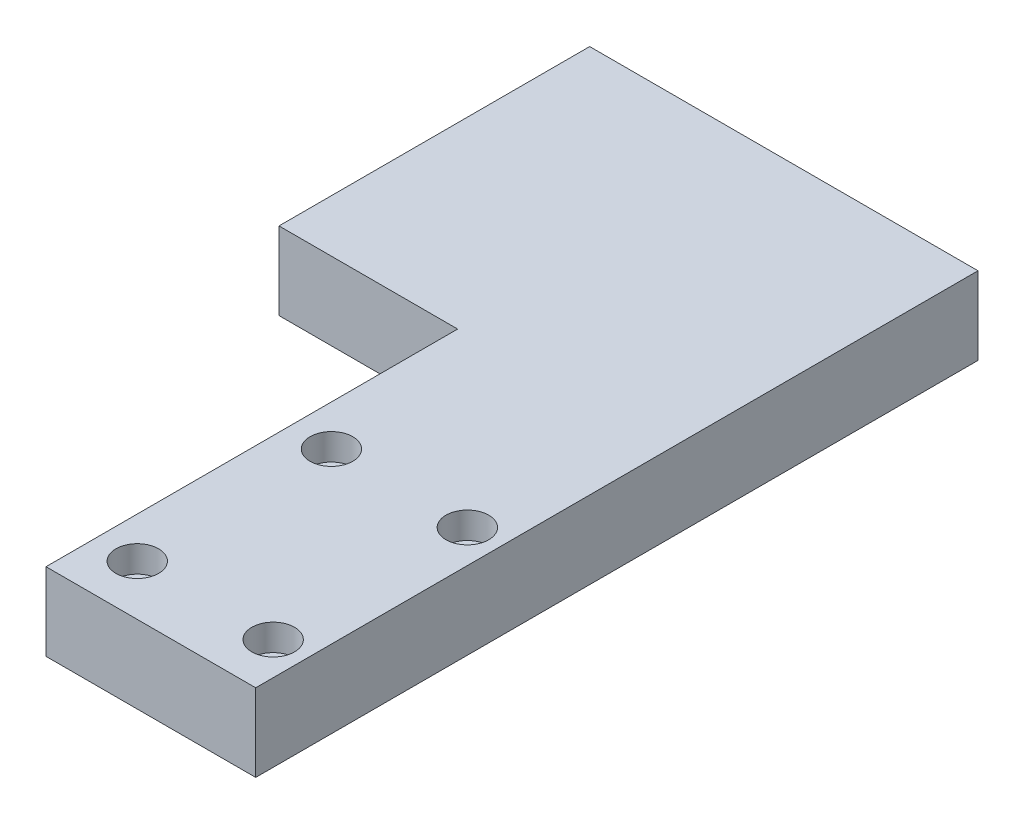
ISO-10303-21;
HEADER;
FILE_DESCRIPTION(('STEP AP214'),'2;1');
FILE_NAME('part.step','',(''),(''),'','','');
FILE_SCHEMA(('AUTOMOTIVE_DESIGN { 1 0 10303 214 1 1 1 1 }'));
ENDSEC;
DATA;
#1=APPLICATION_CONTEXT('core data for automotive mechanical design processes');
#2=APPLICATION_PROTOCOL_DEFINITION('international standard','automotive_design',2000,#1);
#3=PRODUCT_CONTEXT('',#1,'mechanical');
#4=PRODUCT('Part','Part','',(#3));
#5=PRODUCT_RELATED_PRODUCT_CATEGORY('part','',(#4));
#6=PRODUCT_DEFINITION_FORMATION('','',#4);
#7=PRODUCT_DEFINITION_CONTEXT('part definition',#1,'design');
#8=PRODUCT_DEFINITION('design','',#6,#7);
#9=PRODUCT_DEFINITION_SHAPE('','',#8);
#10=(LENGTH_UNIT() NAMED_UNIT(*) SI_UNIT(.MILLI.,.METRE.));
#11=(NAMED_UNIT(*) PLANE_ANGLE_UNIT() SI_UNIT($,.RADIAN.));
#12=(NAMED_UNIT(*) SI_UNIT($,.STERADIAN.) SOLID_ANGLE_UNIT());
#13=UNCERTAINTY_MEASURE_WITH_UNIT(LENGTH_MEASURE(1.E-05),#10,'distance_accuracy_value','');
#14=(GEOMETRIC_REPRESENTATION_CONTEXT(3) GLOBAL_UNCERTAINTY_ASSIGNED_CONTEXT((#13)) GLOBAL_UNIT_ASSIGNED_CONTEXT((#10,
#11,#12)) REPRESENTATION_CONTEXT('',''));
#15=CARTESIAN_POINT('',(0.,0.,0.));
#16=DIRECTION('',(0.,0.,1.));
#17=DIRECTION('',(1.,0.,0.));
#18=AXIS2_PLACEMENT_3D('',#15,#16,#17);
#19=CARTESIAN_POINT('',(0.,10.,0.));
#20=DIRECTION('',(0.,-1.,0.));
#21=DIRECTION('',(0.,0.,-1.));
#22=AXIS2_PLACEMENT_3D('',#19,#20,#21);
#23=PLANE('',#22);
#24=DIRECTION('',(1.,0.,0.));
#25=VECTOR('',#24,1.);
#26=CARTESIAN_POINT('',(-96.,10.,-13.));
#27=LINE('',#26,#25);
#28=CARTESIAN_POINT('',(-50.,10.,-13.));
#29=VERTEX_POINT('',#28);
#30=CARTESIAN_POINT('',(-4.,10.,-13.));
#31=VERTEX_POINT('',#30);
#32=EDGE_CURVE('E133',#29,#31,#27,.T.);
#33=ORIENTED_EDGE('',*,*,#32,.T.);
#34=DIRECTION('',(0.,0.,1.));
#35=VECTOR('',#34,1.);
#36=CARTESIAN_POINT('',(-4.,10.,199.));
#37=LINE('',#36,#35);
#38=CARTESIAN_POINT('',(-4.,10.,93.));
#39=VERTEX_POINT('',#38);
#40=EDGE_CURVE('E131',#31,#39,#37,.T.);
#41=ORIENTED_EDGE('',*,*,#40,.T.);
#42=DIRECTION('',(1.,0.,0.));
#43=VECTOR('',#42,1.);
#44=CARTESIAN_POINT('',(-50.,10.,93.));
#45=LINE('',#44,#43);
#46=CARTESIAN_POINT('',(50.,10.,93.));
#47=VERTEX_POINT('',#46);
#48=EDGE_CURVE('E42',#39,#47,#45,.T.);
#49=ORIENTED_EDGE('',*,*,#48,.T.);
#50=DIRECTION('',(0.,0.,-1.));
#51=VECTOR('',#50,1.);
#52=CARTESIAN_POINT('',(50.,10.,93.));
#53=LINE('',#52,#51);
#54=CARTESIAN_POINT('',(50.,10.,-93.));
#55=VERTEX_POINT('',#54);
#56=EDGE_CURVE('E144',#47,#55,#53,.T.);
#57=ORIENTED_EDGE('',*,*,#56,.T.);
#58=DIRECTION('',(-1.,0.,0.));
#59=VECTOR('',#58,1.);
#60=CARTESIAN_POINT('',(-50.,10.,-93.));
#61=LINE('',#60,#59);
#62=CARTESIAN_POINT('',(-50.,10.,-93.));
#63=VERTEX_POINT('',#62);
#64=EDGE_CURVE('E66',#55,#63,#61,.T.);
#65=ORIENTED_EDGE('',*,*,#64,.T.);
#66=DIRECTION('',(0.,0.,1.));
#67=VECTOR('',#66,1.);
#68=CARTESIAN_POINT('',(-50.,10.,93.));
#69=LINE('',#68,#67);
#70=EDGE_CURVE('E147',#63,#29,#69,.T.);
#71=ORIENTED_EDGE('',*,*,#70,.T.);
#72=EDGE_LOOP('',(#33,#41,#49,#57,#65,#71));
#73=FACE_BOUND('',#72,.T.);
#74=CARTESIAN_POINT('',(41.5,10.,80.));
#75=DIRECTION('',(0.,1.,0.));
#76=DIRECTION('',(0.,0.,1.));
#77=AXIS2_PLACEMENT_3D('',#74,#75,#76);
#78=CIRCLE('',#77,5.5);
#79=CARTESIAN_POINT('',(41.5,10.,85.5));
#80=VERTEX_POINT('',#79);
#81=EDGE_CURVE('E172',#80,#80,#78,.T.);
#82=ORIENTED_EDGE('',*,*,#81,.F.);
#83=EDGE_LOOP('',(#82));
#84=FACE_BOUND('',#83,.T.);
#85=CARTESIAN_POINT('',(41.5,10.,30.));
#86=DIRECTION('',(0.,1.,0.));
#87=DIRECTION('',(0.,0.,1.));
#88=AXIS2_PLACEMENT_3D('',#85,#86,#87);
#89=CIRCLE('',#88,5.5);
#90=CARTESIAN_POINT('',(41.5,10.,35.5));
#91=VERTEX_POINT('',#90);
#92=EDGE_CURVE('E176',#91,#91,#89,.T.);
#93=ORIENTED_EDGE('',*,*,#92,.F.);
#94=EDGE_LOOP('',(#93));
#95=FACE_BOUND('',#94,.T.);
#96=CARTESIAN_POINT('',(6.5,10.,80.));
#97=DIRECTION('',(0.,1.,0.));
#98=DIRECTION('',(0.,0.,1.));
#99=AXIS2_PLACEMENT_3D('',#96,#97,#98);
#100=CIRCLE('',#99,5.5);
#101=CARTESIAN_POINT('',(6.5,10.,85.5));
#102=VERTEX_POINT('',#101);
#103=EDGE_CURVE('E384',#102,#102,#100,.T.);
#104=ORIENTED_EDGE('',*,*,#103,.F.);
#105=EDGE_LOOP('',(#104));
#106=FACE_BOUND('',#105,.T.);
#107=CARTESIAN_POINT('',(6.5,10.,30.));
#108=DIRECTION('',(0.,1.,0.));
#109=DIRECTION('',(0.,0.,1.));
#110=AXIS2_PLACEMENT_3D('',#107,#108,#109);
#111=CIRCLE('',#110,5.5);
#112=CARTESIAN_POINT('',(6.5,10.,35.5));
#113=VERTEX_POINT('',#112);
#114=EDGE_CURVE('E373',#113,#113,#111,.T.);
#115=ORIENTED_EDGE('',*,*,#114,.F.);
#116=EDGE_LOOP('',(#115));
#117=FACE_BOUND('',#116,.T.);
#118=ADVANCED_FACE('F17',(#73,#84,#95,#106,#117),#23,.F.);
#119=CARTESIAN_POINT('',(50.,10.,93.));
#120=DIRECTION('',(-1.,0.,0.));
#121=DIRECTION('',(0.,0.,1.));
#122=AXIS2_PLACEMENT_3D('',#119,#120,#121);
#123=PLANE('',#122);
#124=DIRECTION('',(0.,0.,-1.));
#125=VECTOR('',#124,1.);
#126=CARTESIAN_POINT('',(50.,-10.,93.));
#127=LINE('',#126,#125);
#128=CARTESIAN_POINT('',(50.,-10.,93.));
#129=VERTEX_POINT('',#128);
#130=CARTESIAN_POINT('',(50.,-10.,-93.));
#131=VERTEX_POINT('',#130);
#132=EDGE_CURVE('E143',#129,#131,#127,.T.);
#133=ORIENTED_EDGE('',*,*,#132,.T.);
#134=DIRECTION('',(0.,-1.,0.));
#135=VECTOR('',#134,1.);
#136=CARTESIAN_POINT('',(50.,10.,-93.));
#137=LINE('',#136,#135);
#138=EDGE_CURVE('E26',#55,#131,#137,.T.);
#139=ORIENTED_EDGE('',*,*,#138,.F.);
#140=ORIENTED_EDGE('',*,*,#56,.F.);
#141=DIRECTION('',(0.,-1.,0.));
#142=VECTOR('',#141,1.);
#143=CARTESIAN_POINT('',(50.,10.,93.));
#144=LINE('',#143,#142);
#145=EDGE_CURVE('E151',#47,#129,#144,.T.);
#146=ORIENTED_EDGE('',*,*,#145,.T.);
#147=EDGE_LOOP('',(#133,#139,#140,#146));
#148=FACE_BOUND('',#147,.T.);
#149=ADVANCED_FACE('F19',(#148),#123,.F.);
#150=CARTESIAN_POINT('',(-50.,10.,-93.));
#151=DIRECTION('',(0.,0.,1.));
#152=DIRECTION('',(1.,0.,0.));
#153=AXIS2_PLACEMENT_3D('',#150,#151,#152);
#154=PLANE('',#153);
#155=DIRECTION('',(-1.,0.,0.));
#156=VECTOR('',#155,1.);
#157=CARTESIAN_POINT('',(-50.,-10.,-93.));
#158=LINE('',#157,#156);
#159=CARTESIAN_POINT('',(-50.,-10.,-93.));
#160=VERTEX_POINT('',#159);
#161=EDGE_CURVE('E154',#131,#160,#158,.T.);
#162=ORIENTED_EDGE('',*,*,#161,.T.);
#163=DIRECTION('',(0.,-1.,0.));
#164=VECTOR('',#163,1.);
#165=CARTESIAN_POINT('',(-50.,10.,-93.));
#166=LINE('',#165,#164);
#167=EDGE_CURVE('E161',#63,#160,#166,.T.);
#168=ORIENTED_EDGE('',*,*,#167,.F.);
#169=ORIENTED_EDGE('',*,*,#64,.F.);
#170=ORIENTED_EDGE('',*,*,#138,.T.);
#171=EDGE_LOOP('',(#162,#168,#169,#170));
#172=FACE_BOUND('',#171,.T.);
#173=ADVANCED_FACE('F227',(#172),#154,.F.);
#174=CARTESIAN_POINT('',(-50.,10.,93.));
#175=DIRECTION('',(1.,0.,0.));
#176=DIRECTION('',(0.,0.,-1.));
#177=AXIS2_PLACEMENT_3D('',#174,#175,#176);
#178=PLANE('',#177);
#179=CARTESIAN_POINT('',(-50.,0.,-83.));
#180=DIRECTION('',(-1.,0.,0.));
#181=DIRECTION('',(0.,0.,1.));
#182=AXIS2_PLACEMENT_3D('',#179,#180,#181);
#183=CIRCLE('',#182,4.);
#184=CARTESIAN_POINT('',(-50.,0.,-79.));
#185=VERTEX_POINT('',#184);
#186=EDGE_CURVE('E168',#185,#185,#183,.T.);
#187=ORIENTED_EDGE('',*,*,#186,.F.);
#188=EDGE_LOOP('',(#187));
#189=FACE_BOUND('',#188,.T.);
#190=CARTESIAN_POINT('',(-50.,0.,-53.));
#191=DIRECTION('',(-1.,0.,0.));
#192=DIRECTION('',(0.,0.,1.));
#193=AXIS2_PLACEMENT_3D('',#190,#191,#192);
#194=CIRCLE('',#193,4.);
#195=CARTESIAN_POINT('',(-50.,0.,-49.));
#196=VERTEX_POINT('',#195);
#197=EDGE_CURVE('E99',#196,#196,#194,.T.);
#198=ORIENTED_EDGE('',*,*,#197,.F.);
#199=EDGE_LOOP('',(#198));
#200=FACE_BOUND('',#199,.T.);
#201=CARTESIAN_POINT('',(-50.,0.,-23.));
#202=DIRECTION('',(-1.,0.,0.));
#203=DIRECTION('',(0.,0.,1.));
#204=AXIS2_PLACEMENT_3D('',#201,#202,#203);
#205=CIRCLE('',#204,4.);
#206=CARTESIAN_POINT('',(-50.,0.,-19.));
#207=VERTEX_POINT('',#206);
#208=EDGE_CURVE('E118',#207,#207,#205,.T.);
#209=ORIENTED_EDGE('',*,*,#208,.F.);
#210=EDGE_LOOP('',(#209));
#211=FACE_BOUND('',#210,.T.);
#212=DIRECTION('',(0.,0.,1.));
#213=VECTOR('',#212,1.);
#214=CARTESIAN_POINT('',(-50.,-10.,93.));
#215=LINE('',#214,#213);
#216=CARTESIAN_POINT('',(-50.,-10.,-13.));
#217=VERTEX_POINT('',#216);
#218=EDGE_CURVE('E156',#160,#217,#215,.T.);
#219=ORIENTED_EDGE('',*,*,#218,.T.);
#220=DIRECTION('',(0.,1.,0.));
#221=VECTOR('',#220,1.);
#222=CARTESIAN_POINT('',(-50.,10.,-13.));
#223=LINE('',#222,#221);
#224=EDGE_CURVE('E33',#217,#29,#223,.T.);
#225=ORIENTED_EDGE('',*,*,#224,.T.);
#226=ORIENTED_EDGE('',*,*,#70,.F.);
#227=ORIENTED_EDGE('',*,*,#167,.T.);
#228=EDGE_LOOP('',(#219,#225,#226,#227));
#229=FACE_BOUND('',#228,.T.);
#230=ADVANCED_FACE('F223',(#189,#200,#211,#229),#178,.F.);
#231=CARTESIAN_POINT('',(-50.,10.,93.));
#232=DIRECTION('',(0.,0.,-1.));
#233=DIRECTION('',(-1.,0.,0.));
#234=AXIS2_PLACEMENT_3D('',#231,#232,#233);
#235=PLANE('',#234);
#236=ORIENTED_EDGE('',*,*,#48,.F.);
#237=DIRECTION('',(0.,-1.,0.));
#238=VECTOR('',#237,1.);
#239=CARTESIAN_POINT('',(-4.,10.,93.));
#240=LINE('',#239,#238);
#241=CARTESIAN_POINT('',(-4.,-10.,93.));
#242=VERTEX_POINT('',#241);
#243=EDGE_CURVE('E141',#39,#242,#240,.T.);
#244=ORIENTED_EDGE('',*,*,#243,.T.);
#245=DIRECTION('',(1.,0.,0.));
#246=VECTOR('',#245,1.);
#247=CARTESIAN_POINT('',(-50.,-10.,93.));
#248=LINE('',#247,#246);
#249=EDGE_CURVE('E60',#242,#129,#248,.T.);
#250=ORIENTED_EDGE('',*,*,#249,.T.);
#251=ORIENTED_EDGE('',*,*,#145,.F.);
#252=EDGE_LOOP('',(#236,#244,#250,#251));
#253=FACE_BOUND('',#252,.T.);
#254=ADVANCED_FACE('F226',(#253),#235,.F.);
#255=CARTESIAN_POINT('',(0.,-10.,0.));
#256=DIRECTION('',(0.,-1.,0.));
#257=DIRECTION('',(0.,0.,-1.));
#258=AXIS2_PLACEMENT_3D('',#255,#256,#257);
#259=PLANE('',#258);
#260=CARTESIAN_POINT('',(6.5,-10.,30.));
#261=DIRECTION('',(0.,-1.,0.));
#262=DIRECTION('',(0.,0.,-1.));
#263=AXIS2_PLACEMENT_3D('',#260,#261,#262);
#264=CIRCLE('',#263,2.88393012941235);
#265=CARTESIAN_POINT('',(6.5,-10.,27.1160698705877));
#266=VERTEX_POINT('',#265);
#267=EDGE_CURVE('E21',#266,#266,#264,.T.);
#268=ORIENTED_EDGE('',*,*,#267,.F.);
#269=EDGE_LOOP('',(#268));
#270=FACE_BOUND('',#269,.T.);
#271=CARTESIAN_POINT('',(6.5,-10.,80.));
#272=DIRECTION('',(0.,-1.,0.));
#273=DIRECTION('',(0.,0.,-1.));
#274=AXIS2_PLACEMENT_3D('',#271,#272,#273);
#275=CIRCLE('',#274,2.88393012941235);
#276=CARTESIAN_POINT('',(6.5,-10.,77.1160698705877));
#277=VERTEX_POINT('',#276);
#278=EDGE_CURVE('E174',#277,#277,#275,.T.);
#279=ORIENTED_EDGE('',*,*,#278,.F.);
#280=EDGE_LOOP('',(#279));
#281=FACE_BOUND('',#280,.T.);
#282=CARTESIAN_POINT('',(41.5,-10.,30.));
#283=DIRECTION('',(0.,-1.,0.));
#284=DIRECTION('',(0.,0.,-1.));
#285=AXIS2_PLACEMENT_3D('',#282,#283,#284);
#286=CIRCLE('',#285,2.88393012941235);
#287=CARTESIAN_POINT('',(41.5,-10.,27.1160698705877));
#288=VERTEX_POINT('',#287);
#289=EDGE_CURVE('E170',#288,#288,#286,.T.);
#290=ORIENTED_EDGE('',*,*,#289,.F.);
#291=EDGE_LOOP('',(#290));
#292=FACE_BOUND('',#291,.T.);
#293=CARTESIAN_POINT('',(41.5,-10.,80.));
#294=DIRECTION('',(0.,-1.,0.));
#295=DIRECTION('',(0.,0.,-1.));
#296=AXIS2_PLACEMENT_3D('',#293,#294,#295);
#297=CIRCLE('',#296,2.88393012941235);
#298=CARTESIAN_POINT('',(41.5,-10.,77.1160698705877));
#299=VERTEX_POINT('',#298);
#300=EDGE_CURVE('E165',#299,#299,#297,.T.);
#301=ORIENTED_EDGE('',*,*,#300,.F.);
#302=EDGE_LOOP('',(#301));
#303=FACE_BOUND('',#302,.T.);
#304=DIRECTION('',(0.,0.,1.));
#305=VECTOR('',#304,1.);
#306=CARTESIAN_POINT('',(-4.,-10.,199.));
#307=LINE('',#306,#305);
#308=CARTESIAN_POINT('',(-4.,-10.,-13.));
#309=VERTEX_POINT('',#308);
#310=EDGE_CURVE('E130',#309,#242,#307,.T.);
#311=ORIENTED_EDGE('',*,*,#310,.F.);
#312=DIRECTION('',(1.,0.,0.));
#313=VECTOR('',#312,1.);
#314=CARTESIAN_POINT('',(0.,-10.,-13.));
#315=LINE('',#314,#313);
#316=EDGE_CURVE('E11',#217,#309,#315,.T.);
#317=ORIENTED_EDGE('',*,*,#316,.F.);
#318=ORIENTED_EDGE('',*,*,#218,.F.);
#319=ORIENTED_EDGE('',*,*,#161,.F.);
#320=ORIENTED_EDGE('',*,*,#132,.F.);
#321=ORIENTED_EDGE('',*,*,#249,.F.);
#322=EDGE_LOOP('',(#311,#317,#318,#319,#320,#321));
#323=FACE_BOUND('',#322,.T.);
#324=ADVANCED_FACE('F237',(#270,#281,#292,#303,#323),#259,.T.);
#325=CARTESIAN_POINT('',(-4.,10.,199.));
#326=DIRECTION('',(1.,0.,0.));
#327=DIRECTION('',(0.,0.,-1.));
#328=AXIS2_PLACEMENT_3D('',#325,#326,#327);
#329=PLANE('',#328);
#330=ORIENTED_EDGE('',*,*,#40,.F.);
#331=DIRECTION('',(0.,-1.,0.));
#332=VECTOR('',#331,1.);
#333=CARTESIAN_POINT('',(-4.,10.,-13.));
#334=LINE('',#333,#332);
#335=EDGE_CURVE('E136',#31,#309,#334,.T.);
#336=ORIENTED_EDGE('',*,*,#335,.T.);
#337=ORIENTED_EDGE('',*,*,#310,.T.);
#338=ORIENTED_EDGE('',*,*,#243,.F.);
#339=EDGE_LOOP('',(#330,#336,#337,#338));
#340=FACE_BOUND('',#339,.T.);
#341=ADVANCED_FACE('F242',(#340),#329,.F.);
#342=CARTESIAN_POINT('',(-96.,10.,-13.));
#343=DIRECTION('',(0.,0.,-1.));
#344=DIRECTION('',(-1.,0.,0.));
#345=AXIS2_PLACEMENT_3D('',#342,#343,#344);
#346=PLANE('',#345);
#347=ORIENTED_EDGE('',*,*,#316,.T.);
#348=ORIENTED_EDGE('',*,*,#335,.F.);
#349=ORIENTED_EDGE('',*,*,#32,.F.);
#350=ORIENTED_EDGE('',*,*,#224,.F.);
#351=EDGE_LOOP('',(#347,#348,#349,#350));
#352=FACE_BOUND('',#351,.T.);
#353=ADVANCED_FACE('F239',(#352),#346,.F.);
#354=CARTESIAN_POINT('',(-30.25,0.,-23.));
#355=DIRECTION('',(-1.,0.,0.));
#356=DIRECTION('',(0.,0.,1.));
#357=AXIS2_PLACEMENT_3D('',#354,#355,#356);
#358=CONICAL_SURFACE('',#357,3.4,1.02974425867665);
#359=CARTESIAN_POINT('',(-28.2070738953063,0.,-23.));
#360=VERTEX_POINT('',#359);
#361=VERTEX_LOOP('',#360);
#362=FACE_BOUND('',#361,.T.);
#363=CARTESIAN_POINT('',(-30.25,0.,-23.));
#364=DIRECTION('',(-1.,0.,0.));
#365=DIRECTION('',(0.,0.,1.));
#366=AXIS2_PLACEMENT_3D('',#363,#364,#365);
#367=CIRCLE('',#366,3.4);
#368=CARTESIAN_POINT('',(-30.25,0.,-19.6));
#369=VERTEX_POINT('',#368);
#370=EDGE_CURVE('E127',#369,#369,#367,.T.);
#371=ORIENTED_EDGE('',*,*,#370,.T.);
#372=EDGE_LOOP('',(#371));
#373=FACE_BOUND('',#372,.T.);
#374=ADVANCED_FACE('F267',(#362,#373),#358,.F.);
#375=CARTESIAN_POINT('',(-50.,0.,-23.));
#376=DIRECTION('',(-1.,0.,0.));
#377=DIRECTION('',(0.,0.,1.));
#378=AXIS2_PLACEMENT_3D('',#375,#376,#377);
#379=CYLINDRICAL_SURFACE('',#378,3.4);
#380=ORIENTED_EDGE('',*,*,#370,.F.);
#381=EDGE_LOOP('',(#380));
#382=FACE_BOUND('',#381,.T.);
#383=CARTESIAN_POINT('',(-34.,0.,-23.));
#384=DIRECTION('',(-1.,0.,0.));
#385=DIRECTION('',(0.,0.,1.));
#386=AXIS2_PLACEMENT_3D('',#383,#384,#385);
#387=CIRCLE('',#386,3.4);
#388=CARTESIAN_POINT('',(-34.,0.,-19.6));
#389=VERTEX_POINT('',#388);
#390=EDGE_CURVE('E124',#389,#389,#387,.T.);
#391=ORIENTED_EDGE('',*,*,#390,.T.);
#392=EDGE_LOOP('',(#391));
#393=FACE_BOUND('',#392,.T.);
#394=ADVANCED_FACE('F270',(#382,#393),#379,.F.);
#395=CARTESIAN_POINT('',(-34.,3.4,-23.));
#396=DIRECTION('',(1.,0.,0.));
#397=DIRECTION('',(0.,0.,-1.));
#398=AXIS2_PLACEMENT_3D('',#395,#396,#397);
#399=PLANE('',#398);
#400=ORIENTED_EDGE('',*,*,#390,.F.);
#401=EDGE_LOOP('',(#400));
#402=FACE_BOUND('',#401,.T.);
#403=CARTESIAN_POINT('',(-34.,0.,-23.));
#404=DIRECTION('',(-1.,0.,0.));
#405=DIRECTION('',(0.,0.,1.));
#406=AXIS2_PLACEMENT_3D('',#403,#404,#405);
#407=CIRCLE('',#406,4.);
#408=CARTESIAN_POINT('',(-34.,0.,-19.));
#409=VERTEX_POINT('',#408);
#410=EDGE_CURVE('E121',#409,#409,#407,.T.);
#411=ORIENTED_EDGE('',*,*,#410,.T.);
#412=EDGE_LOOP('',(#411));
#413=FACE_BOUND('',#412,.T.);
#414=ADVANCED_FACE('F274',(#402,#413),#399,.F.);
#415=CARTESIAN_POINT('',(-50.,0.,-23.));
#416=DIRECTION('',(-1.,0.,0.));
#417=DIRECTION('',(0.,0.,1.));
#418=AXIS2_PLACEMENT_3D('',#415,#416,#417);
#419=CYLINDRICAL_SURFACE('',#418,4.);
#420=ORIENTED_EDGE('',*,*,#410,.F.);
#421=EDGE_LOOP('',(#420));
#422=FACE_BOUND('',#421,.T.);
#423=ORIENTED_EDGE('',*,*,#208,.T.);
#424=EDGE_LOOP('',(#423));
#425=FACE_BOUND('',#424,.T.);
#426=ADVANCED_FACE('F278',(#422,#425),#419,.F.);
#427=CARTESIAN_POINT('',(-30.25,0.,-53.));
#428=DIRECTION('',(-1.,0.,0.));
#429=DIRECTION('',(0.,0.,1.));
#430=AXIS2_PLACEMENT_3D('',#427,#428,#429);
#431=CONICAL_SURFACE('',#430,3.4,1.02974425867665);
#432=CARTESIAN_POINT('',(-28.2070738953063,0.,-53.));
#433=VERTEX_POINT('',#432);
#434=VERTEX_LOOP('',#433);
#435=FACE_BOUND('',#434,.T.);
#436=CARTESIAN_POINT('',(-30.25,0.,-53.));
#437=DIRECTION('',(-1.,0.,0.));
#438=DIRECTION('',(0.,0.,1.));
#439=AXIS2_PLACEMENT_3D('',#436,#437,#438);
#440=CIRCLE('',#439,3.4);
#441=CARTESIAN_POINT('',(-30.25,0.,-49.6));
#442=VERTEX_POINT('',#441);
#443=EDGE_CURVE('E115',#442,#442,#440,.T.);
#444=ORIENTED_EDGE('',*,*,#443,.T.);
#445=EDGE_LOOP('',(#444));
#446=FACE_BOUND('',#445,.T.);
#447=ADVANCED_FACE('F282',(#435,#446),#431,.F.);
#448=CARTESIAN_POINT('',(-50.,0.,-53.));
#449=DIRECTION('',(-1.,0.,0.));
#450=DIRECTION('',(0.,0.,1.));
#451=AXIS2_PLACEMENT_3D('',#448,#449,#450);
#452=CYLINDRICAL_SURFACE('',#451,3.4);
#453=ORIENTED_EDGE('',*,*,#443,.F.);
#454=EDGE_LOOP('',(#453));
#455=FACE_BOUND('',#454,.T.);
#456=CARTESIAN_POINT('',(-34.,0.,-53.));
#457=DIRECTION('',(-1.,0.,0.));
#458=DIRECTION('',(0.,0.,1.));
#459=AXIS2_PLACEMENT_3D('',#456,#457,#458);
#460=CIRCLE('',#459,3.4);
#461=CARTESIAN_POINT('',(-34.,0.,-49.6));
#462=VERTEX_POINT('',#461);
#463=EDGE_CURVE('E112',#462,#462,#460,.T.);
#464=ORIENTED_EDGE('',*,*,#463,.T.);
#465=EDGE_LOOP('',(#464));
#466=FACE_BOUND('',#465,.T.);
#467=ADVANCED_FACE('F286',(#455,#466),#452,.F.);
#468=CARTESIAN_POINT('',(-34.,3.4,-53.));
#469=DIRECTION('',(1.,0.,0.));
#470=DIRECTION('',(0.,0.,-1.));
#471=AXIS2_PLACEMENT_3D('',#468,#469,#470);
#472=PLANE('',#471);
#473=ORIENTED_EDGE('',*,*,#463,.F.);
#474=EDGE_LOOP('',(#473));
#475=FACE_BOUND('',#474,.T.);
#476=CARTESIAN_POINT('',(-34.,0.,-53.));
#477=DIRECTION('',(-1.,0.,0.));
#478=DIRECTION('',(0.,0.,1.));
#479=AXIS2_PLACEMENT_3D('',#476,#477,#478);
#480=CIRCLE('',#479,4.);
#481=CARTESIAN_POINT('',(-34.,0.,-49.));
#482=VERTEX_POINT('',#481);
#483=EDGE_CURVE('E103',#482,#482,#480,.T.);
#484=ORIENTED_EDGE('',*,*,#483,.T.);
#485=EDGE_LOOP('',(#484));
#486=FACE_BOUND('',#485,.T.);
#487=ADVANCED_FACE('F290',(#475,#486),#472,.F.);
#488=CARTESIAN_POINT('',(-50.,0.,-53.));
#489=DIRECTION('',(-1.,0.,0.));
#490=DIRECTION('',(0.,0.,1.));
#491=AXIS2_PLACEMENT_3D('',#488,#489,#490);
#492=CYLINDRICAL_SURFACE('',#491,4.);
#493=ORIENTED_EDGE('',*,*,#483,.F.);
#494=EDGE_LOOP('',(#493));
#495=FACE_BOUND('',#494,.T.);
#496=ORIENTED_EDGE('',*,*,#197,.T.);
#497=EDGE_LOOP('',(#496));
#498=FACE_BOUND('',#497,.T.);
#499=ADVANCED_FACE('F93',(#495,#498),#492,.F.);
#500=CARTESIAN_POINT('',(-30.25,0.,-83.));
#501=DIRECTION('',(-1.,0.,0.));
#502=DIRECTION('',(0.,0.,1.));
#503=AXIS2_PLACEMENT_3D('',#500,#501,#502);
#504=CONICAL_SURFACE('',#503,3.4,1.02974425867665);
#505=CARTESIAN_POINT('',(-28.2070738953063,0.,-83.));
#506=VERTEX_POINT('',#505);
#507=VERTEX_LOOP('',#506);
#508=FACE_BOUND('',#507,.T.);
#509=CARTESIAN_POINT('',(-30.25,0.,-83.));
#510=DIRECTION('',(-1.,0.,0.));
#511=DIRECTION('',(0.,0.,1.));
#512=AXIS2_PLACEMENT_3D('',#509,#510,#511);
#513=CIRCLE('',#512,3.4);
#514=CARTESIAN_POINT('',(-30.25,0.,-79.6));
#515=VERTEX_POINT('',#514);
#516=EDGE_CURVE('E97',#515,#515,#513,.T.);
#517=ORIENTED_EDGE('',*,*,#516,.T.);
#518=EDGE_LOOP('',(#517));
#519=FACE_BOUND('',#518,.T.);
#520=ADVANCED_FACE('F89',(#508,#519),#504,.F.);
#521=CARTESIAN_POINT('',(-50.,0.,-83.));
#522=DIRECTION('',(-1.,0.,0.));
#523=DIRECTION('',(0.,0.,1.));
#524=AXIS2_PLACEMENT_3D('',#521,#522,#523);
#525=CYLINDRICAL_SURFACE('',#524,3.4);
#526=ORIENTED_EDGE('',*,*,#516,.F.);
#527=EDGE_LOOP('',(#526));
#528=FACE_BOUND('',#527,.T.);
#529=CARTESIAN_POINT('',(-34.,0.,-83.));
#530=DIRECTION('',(-1.,0.,0.));
#531=DIRECTION('',(0.,0.,1.));
#532=AXIS2_PLACEMENT_3D('',#529,#530,#531);
#533=CIRCLE('',#532,3.4);
#534=CARTESIAN_POINT('',(-34.,0.,-79.6));
#535=VERTEX_POINT('',#534);
#536=EDGE_CURVE('E100',#535,#535,#533,.T.);
#537=ORIENTED_EDGE('',*,*,#536,.T.);
#538=EDGE_LOOP('',(#537));
#539=FACE_BOUND('',#538,.T.);
#540=ADVANCED_FACE('F92',(#528,#539),#525,.F.);
#541=CARTESIAN_POINT('',(-34.,3.4,-83.));
#542=DIRECTION('',(1.,0.,0.));
#543=DIRECTION('',(0.,0.,-1.));
#544=AXIS2_PLACEMENT_3D('',#541,#542,#543);
#545=PLANE('',#544);
#546=ORIENTED_EDGE('',*,*,#536,.F.);
#547=EDGE_LOOP('',(#546));
#548=FACE_BOUND('',#547,.T.);
#549=CARTESIAN_POINT('',(-34.,0.,-83.));
#550=DIRECTION('',(-1.,0.,0.));
#551=DIRECTION('',(0.,0.,1.));
#552=AXIS2_PLACEMENT_3D('',#549,#550,#551);
#553=CIRCLE('',#552,4.);
#554=CARTESIAN_POINT('',(-34.,0.,-79.));
#555=VERTEX_POINT('',#554);
#556=EDGE_CURVE('E106',#555,#555,#553,.T.);
#557=ORIENTED_EDGE('',*,*,#556,.T.);
#558=EDGE_LOOP('',(#557));
#559=FACE_BOUND('',#558,.T.);
#560=ADVANCED_FACE('F214',(#548,#559),#545,.F.);
#561=CARTESIAN_POINT('',(-50.,0.,-83.));
#562=DIRECTION('',(-1.,0.,0.));
#563=DIRECTION('',(0.,0.,1.));
#564=AXIS2_PLACEMENT_3D('',#561,#562,#563);
#565=CYLINDRICAL_SURFACE('',#564,4.);
#566=ORIENTED_EDGE('',*,*,#556,.F.);
#567=EDGE_LOOP('',(#566));
#568=FACE_BOUND('',#567,.T.);
#569=ORIENTED_EDGE('',*,*,#186,.T.);
#570=EDGE_LOOP('',(#569));
#571=FACE_BOUND('',#570,.T.);
#572=ADVANCED_FACE('F216',(#568,#571),#565,.F.);
#573=CARTESIAN_POINT('',(41.5,-9.75,80.));
#574=DIRECTION('',(0.,1.,0.));
#575=DIRECTION('',(0.,0.,1.));
#576=AXIS2_PLACEMENT_3D('',#573,#574,#575);
#577=CONICAL_SURFACE('',#576,3.3,1.02974425867665);
#578=ORIENTED_EDGE('',*,*,#300,.T.);
#579=EDGE_LOOP('',(#578));
#580=FACE_BOUND('',#579,.T.);
#581=CARTESIAN_POINT('',(41.5,-9.75,80.));
#582=DIRECTION('',(0.,1.,0.));
#583=DIRECTION('',(0.,0.,1.));
#584=AXIS2_PLACEMENT_3D('',#581,#582,#583);
#585=CIRCLE('',#584,3.3);
#586=CARTESIAN_POINT('',(41.5,-9.75,83.3));
#587=VERTEX_POINT('',#586);
#588=EDGE_CURVE('E169',#587,#587,#585,.T.);
#589=ORIENTED_EDGE('',*,*,#588,.T.);
#590=EDGE_LOOP('',(#589));
#591=FACE_BOUND('',#590,.T.);
#592=ADVANCED_FACE('F219',(#580,#591),#577,.F.);
#593=CARTESIAN_POINT('',(41.5,10.,80.));
#594=DIRECTION('',(0.,1.,0.));
#595=DIRECTION('',(0.,0.,1.));
#596=AXIS2_PLACEMENT_3D('',#593,#594,#595);
#597=CYLINDRICAL_SURFACE('',#596,3.3);
#598=ORIENTED_EDGE('',*,*,#588,.F.);
#599=EDGE_LOOP('',(#598));
#600=FACE_BOUND('',#599,.T.);
#601=CARTESIAN_POINT('',(41.5,3.2,80.));
#602=DIRECTION('',(0.,1.,0.));
#603=DIRECTION('',(0.,0.,1.));
#604=AXIS2_PLACEMENT_3D('',#601,#602,#603);
#605=CIRCLE('',#604,3.3);
#606=CARTESIAN_POINT('',(41.5,3.2,83.3));
#607=VERTEX_POINT('',#606);
#608=EDGE_CURVE('E205',#607,#607,#605,.T.);
#609=ORIENTED_EDGE('',*,*,#608,.T.);
#610=EDGE_LOOP('',(#609));
#611=FACE_BOUND('',#610,.T.);
#612=ADVANCED_FACE('F305',(#600,#611),#597,.F.);
#613=CARTESIAN_POINT('',(44.8,3.2,80.));
#614=DIRECTION('',(0.,-1.,0.));
#615=DIRECTION('',(0.,0.,-1.));
#616=AXIS2_PLACEMENT_3D('',#613,#614,#615);
#617=PLANE('',#616);
#618=ORIENTED_EDGE('',*,*,#608,.F.);
#619=EDGE_LOOP('',(#618));
#620=FACE_BOUND('',#619,.T.);
#621=CARTESIAN_POINT('',(41.5,3.2,80.));
#622=DIRECTION('',(0.,1.,0.));
#623=DIRECTION('',(0.,0.,1.));
#624=AXIS2_PLACEMENT_3D('',#621,#622,#623);
#625=CIRCLE('',#624,5.5);
#626=CARTESIAN_POINT('',(41.5,3.2,85.5));
#627=VERTEX_POINT('',#626);
#628=EDGE_CURVE('E202',#627,#627,#625,.T.);
#629=ORIENTED_EDGE('',*,*,#628,.T.);
#630=EDGE_LOOP('',(#629));
#631=FACE_BOUND('',#630,.T.);
#632=ADVANCED_FACE('F309',(#620,#631),#617,.F.);
#633=CARTESIAN_POINT('',(41.5,10.,80.));
#634=DIRECTION('',(0.,1.,0.));
#635=DIRECTION('',(0.,0.,1.));
#636=AXIS2_PLACEMENT_3D('',#633,#634,#635);
#637=CYLINDRICAL_SURFACE('',#636,5.5);
#638=ORIENTED_EDGE('',*,*,#628,.F.);
#639=EDGE_LOOP('',(#638));
#640=FACE_BOUND('',#639,.T.);
#641=ORIENTED_EDGE('',*,*,#81,.T.);
#642=EDGE_LOOP('',(#641));
#643=FACE_BOUND('',#642,.T.);
#644=ADVANCED_FACE('F313',(#640,#643),#637,.F.);
#645=CARTESIAN_POINT('',(41.5,-9.75,30.));
#646=DIRECTION('',(0.,1.,0.));
#647=DIRECTION('',(0.,0.,1.));
#648=AXIS2_PLACEMENT_3D('',#645,#646,#647);
#649=CONICAL_SURFACE('',#648,3.3,1.02974425867665);
#650=ORIENTED_EDGE('',*,*,#289,.T.);
#651=EDGE_LOOP('',(#650));
#652=FACE_BOUND('',#651,.T.);
#653=CARTESIAN_POINT('',(41.5,-9.75,30.));
#654=DIRECTION('',(0.,1.,0.));
#655=DIRECTION('',(0.,0.,1.));
#656=AXIS2_PLACEMENT_3D('',#653,#654,#655);
#657=CIRCLE('',#656,3.3);
#658=CARTESIAN_POINT('',(41.5,-9.75,33.3));
#659=VERTEX_POINT('',#658);
#660=EDGE_CURVE('E173',#659,#659,#657,.T.);
#661=ORIENTED_EDGE('',*,*,#660,.T.);
#662=EDGE_LOOP('',(#661));
#663=FACE_BOUND('',#662,.T.);
#664=ADVANCED_FACE('F317',(#652,#663),#649,.F.);
#665=CARTESIAN_POINT('',(41.5,10.,30.));
#666=DIRECTION('',(0.,1.,0.));
#667=DIRECTION('',(0.,0.,1.));
#668=AXIS2_PLACEMENT_3D('',#665,#666,#667);
#669=CYLINDRICAL_SURFACE('',#668,3.3);
#670=ORIENTED_EDGE('',*,*,#660,.F.);
#671=EDGE_LOOP('',(#670));
#672=FACE_BOUND('',#671,.T.);
#673=CARTESIAN_POINT('',(41.5,3.2,30.));
#674=DIRECTION('',(0.,1.,0.));
#675=DIRECTION('',(0.,0.,1.));
#676=AXIS2_PLACEMENT_3D('',#673,#674,#675);
#677=CIRCLE('',#676,3.3);
#678=CARTESIAN_POINT('',(41.5,3.2,33.3));
#679=VERTEX_POINT('',#678);
#680=EDGE_CURVE('E195',#679,#679,#677,.T.);
#681=ORIENTED_EDGE('',*,*,#680,.T.);
#682=EDGE_LOOP('',(#681));
#683=FACE_BOUND('',#682,.T.);
#684=ADVANCED_FACE('F321',(#672,#683),#669,.F.);
#685=CARTESIAN_POINT('',(44.8,3.2,30.));
#686=DIRECTION('',(0.,-1.,0.));
#687=DIRECTION('',(0.,0.,-1.));
#688=AXIS2_PLACEMENT_3D('',#685,#686,#687);
#689=PLANE('',#688);
#690=ORIENTED_EDGE('',*,*,#680,.F.);
#691=EDGE_LOOP('',(#690));
#692=FACE_BOUND('',#691,.T.);
#693=CARTESIAN_POINT('',(41.5,3.2,30.));
#694=DIRECTION('',(0.,1.,0.));
#695=DIRECTION('',(0.,0.,1.));
#696=AXIS2_PLACEMENT_3D('',#693,#694,#695);
#697=CIRCLE('',#696,5.5);
#698=CARTESIAN_POINT('',(41.5,3.2,35.5));
#699=VERTEX_POINT('',#698);
#700=EDGE_CURVE('E181',#699,#699,#697,.T.);
#701=ORIENTED_EDGE('',*,*,#700,.T.);
#702=EDGE_LOOP('',(#701));
#703=FACE_BOUND('',#702,.T.);
#704=ADVANCED_FACE('F325',(#692,#703),#689,.F.);
#705=CARTESIAN_POINT('',(41.5,10.,30.));
#706=DIRECTION('',(0.,1.,0.));
#707=DIRECTION('',(0.,0.,1.));
#708=AXIS2_PLACEMENT_3D('',#705,#706,#707);
#709=CYLINDRICAL_SURFACE('',#708,5.5);
#710=ORIENTED_EDGE('',*,*,#700,.F.);
#711=EDGE_LOOP('',(#710));
#712=FACE_BOUND('',#711,.T.);
#713=ORIENTED_EDGE('',*,*,#92,.T.);
#714=EDGE_LOOP('',(#713));
#715=FACE_BOUND('',#714,.T.);
#716=ADVANCED_FACE('F329',(#712,#715),#709,.F.);
#717=CARTESIAN_POINT('',(6.5,-9.75,80.));
#718=DIRECTION('',(0.,1.,0.));
#719=DIRECTION('',(0.,0.,1.));
#720=AXIS2_PLACEMENT_3D('',#717,#718,#719);
#721=CONICAL_SURFACE('',#720,3.3,1.02974425867665);
#722=ORIENTED_EDGE('',*,*,#278,.T.);
#723=EDGE_LOOP('',(#722));
#724=FACE_BOUND('',#723,.T.);
#725=CARTESIAN_POINT('',(6.5,-9.75,80.));
#726=DIRECTION('',(0.,1.,0.));
#727=DIRECTION('',(0.,0.,1.));
#728=AXIS2_PLACEMENT_3D('',#725,#726,#727);
#729=CIRCLE('',#728,3.3);
#730=CARTESIAN_POINT('',(6.5,-9.75,83.3));
#731=VERTEX_POINT('',#730);
#732=EDGE_CURVE('E177',#731,#731,#729,.T.);
#733=ORIENTED_EDGE('',*,*,#732,.T.);
#734=EDGE_LOOP('',(#733));
#735=FACE_BOUND('',#734,.T.);
#736=ADVANCED_FACE('F333',(#724,#735),#721,.F.);
#737=CARTESIAN_POINT('',(6.5,10.,80.));
#738=DIRECTION('',(0.,1.,0.));
#739=DIRECTION('',(0.,0.,1.));
#740=AXIS2_PLACEMENT_3D('',#737,#738,#739);
#741=CYLINDRICAL_SURFACE('',#740,3.3);
#742=ORIENTED_EDGE('',*,*,#732,.F.);
#743=EDGE_LOOP('',(#742));
#744=FACE_BOUND('',#743,.T.);
#745=CARTESIAN_POINT('',(6.5,3.2,80.));
#746=DIRECTION('',(0.,1.,0.));
#747=DIRECTION('',(0.,0.,1.));
#748=AXIS2_PLACEMENT_3D('',#745,#746,#747);
#749=CIRCLE('',#748,3.3);
#750=CARTESIAN_POINT('',(6.5,3.2,83.3));
#751=VERTEX_POINT('',#750);
#752=EDGE_CURVE('E184',#751,#751,#749,.T.);
#753=ORIENTED_EDGE('',*,*,#752,.T.);
#754=EDGE_LOOP('',(#753));
#755=FACE_BOUND('',#754,.T.);
#756=ADVANCED_FACE('F337',(#744,#755),#741,.F.);
#757=CARTESIAN_POINT('',(9.8,3.2,80.));
#758=DIRECTION('',(0.,-1.,0.));
#759=DIRECTION('',(0.,0.,-1.));
#760=AXIS2_PLACEMENT_3D('',#757,#758,#759);
#761=PLANE('',#760);
#762=ORIENTED_EDGE('',*,*,#752,.F.);
#763=EDGE_LOOP('',(#762));
#764=FACE_BOUND('',#763,.T.);
#765=CARTESIAN_POINT('',(6.5,3.2,80.));
#766=DIRECTION('',(0.,1.,0.));
#767=DIRECTION('',(0.,0.,1.));
#768=AXIS2_PLACEMENT_3D('',#765,#766,#767);
#769=CIRCLE('',#768,5.5);
#770=CARTESIAN_POINT('',(6.5,3.2,85.5));
#771=VERTEX_POINT('',#770);
#772=EDGE_CURVE('E189',#771,#771,#769,.T.);
#773=ORIENTED_EDGE('',*,*,#772,.T.);
#774=EDGE_LOOP('',(#773));
#775=FACE_BOUND('',#774,.T.);
#776=ADVANCED_FACE('F340',(#764,#775),#761,.F.);
#777=CARTESIAN_POINT('',(6.5,10.,80.));
#778=DIRECTION('',(0.,1.,0.));
#779=DIRECTION('',(0.,0.,1.));
#780=AXIS2_PLACEMENT_3D('',#777,#778,#779);
#781=CYLINDRICAL_SURFACE('',#780,5.5);
#782=ORIENTED_EDGE('',*,*,#772,.F.);
#783=EDGE_LOOP('',(#782));
#784=FACE_BOUND('',#783,.T.);
#785=ORIENTED_EDGE('',*,*,#103,.T.);
#786=EDGE_LOOP('',(#785));
#787=FACE_BOUND('',#786,.T.);
#788=ADVANCED_FACE('F344',(#784,#787),#781,.F.);
#789=CARTESIAN_POINT('',(6.5,-9.75,30.));
#790=DIRECTION('',(0.,1.,0.));
#791=DIRECTION('',(0.,0.,1.));
#792=AXIS2_PLACEMENT_3D('',#789,#790,#791);
#793=CONICAL_SURFACE('',#792,3.3,1.02974425867665);
#794=ORIENTED_EDGE('',*,*,#267,.T.);
#795=EDGE_LOOP('',(#794));
#796=FACE_BOUND('',#795,.T.);
#797=CARTESIAN_POINT('',(6.5,-9.75,30.));
#798=DIRECTION('',(0.,1.,0.));
#799=DIRECTION('',(0.,0.,1.));
#800=AXIS2_PLACEMENT_3D('',#797,#798,#799);
#801=CIRCLE('',#800,3.3);
#802=CARTESIAN_POINT('',(6.5,-9.75,33.3));
#803=VERTEX_POINT('',#802);
#804=EDGE_CURVE('E381',#803,#803,#801,.T.);
#805=ORIENTED_EDGE('',*,*,#804,.T.);
#806=EDGE_LOOP('',(#805));
#807=FACE_BOUND('',#806,.T.);
#808=ADVANCED_FACE('F348',(#796,#807),#793,.F.);
#809=CARTESIAN_POINT('',(6.5,10.,30.));
#810=DIRECTION('',(0.,1.,0.));
#811=DIRECTION('',(0.,0.,1.));
#812=AXIS2_PLACEMENT_3D('',#809,#810,#811);
#813=CYLINDRICAL_SURFACE('',#812,3.3);
#814=ORIENTED_EDGE('',*,*,#804,.F.);
#815=EDGE_LOOP('',(#814));
#816=FACE_BOUND('',#815,.T.);
#817=CARTESIAN_POINT('',(6.5,3.2,30.));
#818=DIRECTION('',(0.,1.,0.));
#819=DIRECTION('',(0.,0.,1.));
#820=AXIS2_PLACEMENT_3D('',#817,#818,#819);
#821=CIRCLE('',#820,3.3);
#822=CARTESIAN_POINT('',(6.5,3.2,33.3));
#823=VERTEX_POINT('',#822);
#824=EDGE_CURVE('E376',#823,#823,#821,.T.);
#825=ORIENTED_EDGE('',*,*,#824,.T.);
#826=EDGE_LOOP('',(#825));
#827=FACE_BOUND('',#826,.T.);
#828=ADVANCED_FACE('F352',(#816,#827),#813,.F.);
#829=CARTESIAN_POINT('',(9.8,3.2,30.));
#830=DIRECTION('',(0.,-1.,0.));
#831=DIRECTION('',(0.,0.,-1.));
#832=AXIS2_PLACEMENT_3D('',#829,#830,#831);
#833=PLANE('',#832);
#834=ORIENTED_EDGE('',*,*,#824,.F.);
#835=EDGE_LOOP('',(#834));
#836=FACE_BOUND('',#835,.T.);
#837=CARTESIAN_POINT('',(6.5,3.2,30.));
#838=DIRECTION('',(0.,1.,0.));
#839=DIRECTION('',(0.,0.,1.));
#840=AXIS2_PLACEMENT_3D('',#837,#838,#839);
#841=CIRCLE('',#840,5.5);
#842=CARTESIAN_POINT('',(6.5,3.2,35.5));
#843=VERTEX_POINT('',#842);
#844=EDGE_CURVE('E370',#843,#843,#841,.T.);
#845=ORIENTED_EDGE('',*,*,#844,.T.);
#846=EDGE_LOOP('',(#845));
#847=FACE_BOUND('',#846,.T.);
#848=ADVANCED_FACE('F356',(#836,#847),#833,.F.);
#849=CARTESIAN_POINT('',(6.5,10.,30.));
#850=DIRECTION('',(0.,1.,0.));
#851=DIRECTION('',(0.,0.,1.));
#852=AXIS2_PLACEMENT_3D('',#849,#850,#851);
#853=CYLINDRICAL_SURFACE('',#852,5.5);
#854=ORIENTED_EDGE('',*,*,#844,.F.);
#855=EDGE_LOOP('',(#854));
#856=FACE_BOUND('',#855,.T.);
#857=ORIENTED_EDGE('',*,*,#114,.T.);
#858=EDGE_LOOP('',(#857));
#859=FACE_BOUND('',#858,.T.);
#860=ADVANCED_FACE('F360',(#856,#859),#853,.F.);
#861=CLOSED_SHELL('',(#118,#149,#173,#230,#254,#324,#341,#353,#374,#394,#414,#426,#447,#467,
#487,#499,#520,#540,#560,#572,#592,#612,#632,#644,#664,#684,#704,#716,#736,#756,#776,#788,#808,
#828,#848,#860));
#862=MANIFOLD_SOLID_BREP('B1',#861);
#863=ADVANCED_BREP_SHAPE_REPRESENTATION('',(#18,#862),#14);
#864=SHAPE_DEFINITION_REPRESENTATION(#9,#863);
ENDSEC;
END-ISO-10303-21;
